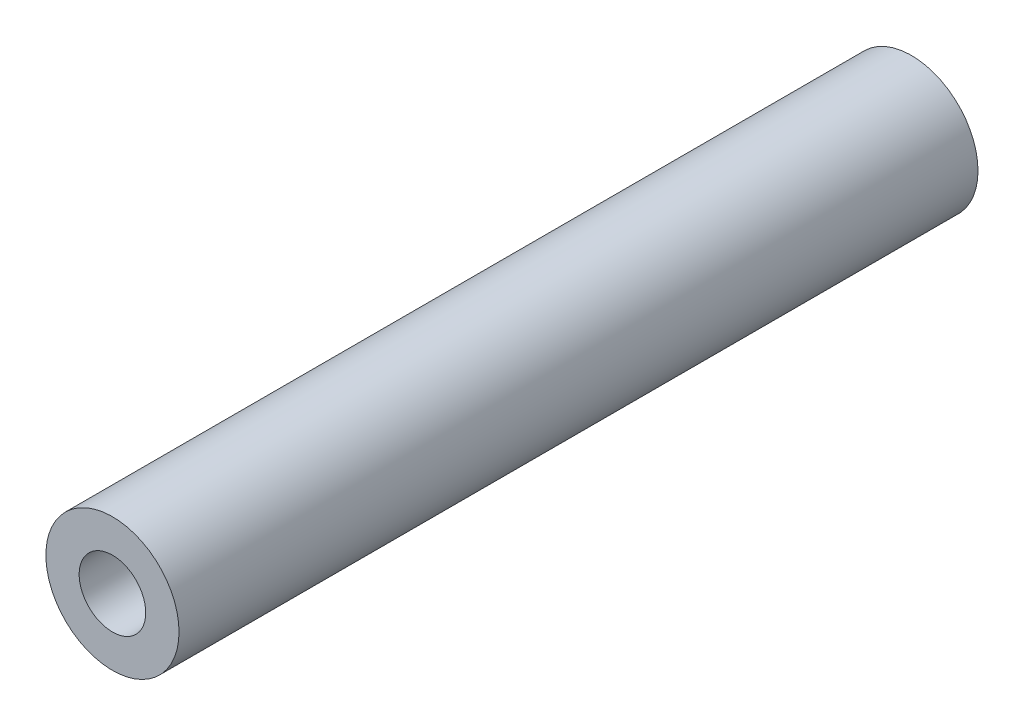
ISO-10303-21;
HEADER;
FILE_DESCRIPTION(('STEP AP214'),'2;1');
FILE_NAME('part.step','',(''),(''),'','','');
FILE_SCHEMA(('AUTOMOTIVE_DESIGN { 1 0 10303 214 1 1 1 1 }'));
ENDSEC;
DATA;
#1=APPLICATION_CONTEXT('core data for automotive mechanical design processes');
#2=APPLICATION_PROTOCOL_DEFINITION('international standard','automotive_design',2000,#1);
#3=PRODUCT_CONTEXT('',#1,'mechanical');
#4=PRODUCT('Part','Part','',(#3));
#5=PRODUCT_RELATED_PRODUCT_CATEGORY('part','',(#4));
#6=PRODUCT_DEFINITION_FORMATION('','',#4);
#7=PRODUCT_DEFINITION_CONTEXT('part definition',#1,'design');
#8=PRODUCT_DEFINITION('design','',#6,#7);
#9=PRODUCT_DEFINITION_SHAPE('','',#8);
#10=(LENGTH_UNIT() NAMED_UNIT(*) SI_UNIT(.MILLI.,.METRE.));
#11=(NAMED_UNIT(*) PLANE_ANGLE_UNIT() SI_UNIT($,.RADIAN.));
#12=(NAMED_UNIT(*) SI_UNIT($,.STERADIAN.) SOLID_ANGLE_UNIT());
#13=UNCERTAINTY_MEASURE_WITH_UNIT(LENGTH_MEASURE(1.E-05),#10,'distance_accuracy_value','');
#14=(GEOMETRIC_REPRESENTATION_CONTEXT(3) GLOBAL_UNCERTAINTY_ASSIGNED_CONTEXT((#13)) GLOBAL_UNIT_ASSIGNED_CONTEXT((#10,
#11,#12)) REPRESENTATION_CONTEXT('',''));
#15=CARTESIAN_POINT('',(0.,0.,0.));
#16=DIRECTION('',(0.,0.,1.));
#17=DIRECTION('',(1.,0.,0.));
#18=AXIS2_PLACEMENT_3D('',#15,#16,#17);
#19=CARTESIAN_POINT('',(0.,0.,120.));
#20=DIRECTION('',(0.,0.,1.));
#21=DIRECTION('',(1.,0.,0.));
#22=AXIS2_PLACEMENT_3D('',#19,#20,#21);
#23=PLANE('',#22);
#24=CARTESIAN_POINT('',(0.,0.,120.));
#25=DIRECTION('',(0.,0.,1.));
#26=DIRECTION('',(1.,0.,0.));
#27=AXIS2_PLACEMENT_3D('',#24,#25,#26);
#28=CIRCLE('',#27,10.);
#29=CARTESIAN_POINT('',(10.,0.,120.));
#30=VERTEX_POINT('',#29);
#31=EDGE_CURVE('E10',#30,#30,#28,.T.);
#32=ORIENTED_EDGE('',*,*,#31,.T.);
#33=EDGE_LOOP('',(#32));
#34=FACE_BOUND('',#33,.T.);
#35=CARTESIAN_POINT('',(0.,0.,120.));
#36=DIRECTION('',(0.,0.,1.));
#37=DIRECTION('',(1.,0.,0.));
#38=AXIS2_PLACEMENT_3D('',#35,#36,#37);
#39=CIRCLE('',#38,5.);
#40=CARTESIAN_POINT('',(5.,0.,120.));
#41=VERTEX_POINT('',#40);
#42=EDGE_CURVE('E48',#41,#41,#39,.T.);
#43=ORIENTED_EDGE('',*,*,#42,.F.);
#44=EDGE_LOOP('',(#43));
#45=FACE_BOUND('',#44,.T.);
#46=ADVANCED_FACE('F37',(#34,#45),#23,.T.);
#47=CARTESIAN_POINT('',(0.,0.,0.));
#48=DIRECTION('',(0.,0.,1.));
#49=DIRECTION('',(1.,0.,0.));
#50=AXIS2_PLACEMENT_3D('',#47,#48,#49);
#51=PLANE('',#50);
#52=CARTESIAN_POINT('',(0.,0.,0.));
#53=DIRECTION('',(0.,0.,1.));
#54=DIRECTION('',(1.,0.,0.));
#55=AXIS2_PLACEMENT_3D('',#52,#53,#54);
#56=CIRCLE('',#55,10.);
#57=CARTESIAN_POINT('',(10.,0.,0.));
#58=VERTEX_POINT('',#57);
#59=EDGE_CURVE('E41',#58,#58,#56,.T.);
#60=ORIENTED_EDGE('',*,*,#59,.F.);
#61=EDGE_LOOP('',(#60));
#62=FACE_BOUND('',#61,.T.);
#63=CARTESIAN_POINT('',(0.,0.,0.));
#64=DIRECTION('',(0.,0.,1.));
#65=DIRECTION('',(1.,0.,0.));
#66=AXIS2_PLACEMENT_3D('',#63,#64,#65);
#67=CIRCLE('',#66,5.);
#68=CARTESIAN_POINT('',(5.,0.,0.));
#69=VERTEX_POINT('',#68);
#70=EDGE_CURVE('E50',#69,#69,#67,.T.);
#71=ORIENTED_EDGE('',*,*,#70,.T.);
#72=EDGE_LOOP('',(#71));
#73=FACE_BOUND('',#72,.T.);
#74=ADVANCED_FACE('F60',(#62,#73),#51,.F.);
#75=CARTESIAN_POINT('',(0.,0.,120.));
#76=DIRECTION('',(0.,0.,-1.));
#77=DIRECTION('',(-1.,0.,0.));
#78=AXIS2_PLACEMENT_3D('',#75,#76,#77);
#79=CYLINDRICAL_SURFACE('',#78,10.);
#80=ORIENTED_EDGE('',*,*,#31,.F.);
#81=EDGE_LOOP('',(#80));
#82=FACE_BOUND('',#81,.T.);
#83=ORIENTED_EDGE('',*,*,#59,.T.);
#84=EDGE_LOOP('',(#83));
#85=FACE_BOUND('',#84,.T.);
#86=ADVANCED_FACE('F39',(#82,#85),#79,.T.);
#87=CARTESIAN_POINT('',(0.,0.,120.));
#88=DIRECTION('',(0.,0.,-1.));
#89=DIRECTION('',(-1.,0.,0.));
#90=AXIS2_PLACEMENT_3D('',#87,#88,#89);
#91=CYLINDRICAL_SURFACE('',#90,5.);
#92=ORIENTED_EDGE('',*,*,#42,.T.);
#93=EDGE_LOOP('',(#92));
#94=FACE_BOUND('',#93,.T.);
#95=ORIENTED_EDGE('',*,*,#70,.F.);
#96=EDGE_LOOP('',(#95));
#97=FACE_BOUND('',#96,.T.);
#98=ADVANCED_FACE('F56',(#94,#97),#91,.F.);
#99=CLOSED_SHELL('',(#46,#74,#86,#98));
#100=MANIFOLD_SOLID_BREP('B2',#99);
#101=ADVANCED_BREP_SHAPE_REPRESENTATION('',(#18,#100),#14);
#102=SHAPE_DEFINITION_REPRESENTATION(#9,#101);
ENDSEC;
END-ISO-10303-21;
